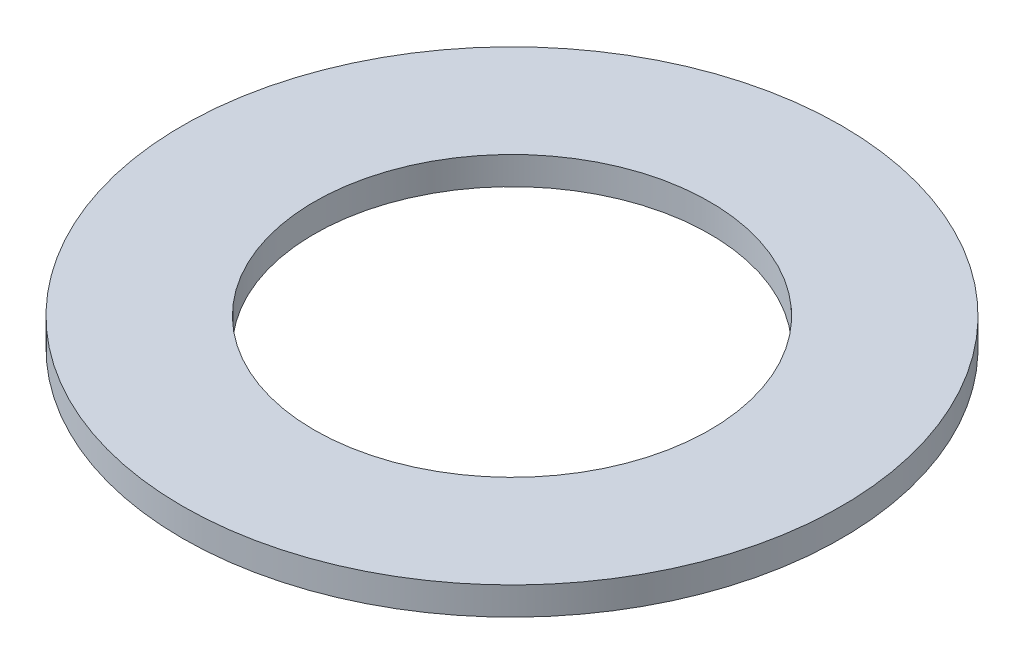
ISO-10303-21;
HEADER;
FILE_DESCRIPTION(('STEP AP214'),'2;1');
FILE_NAME('part.step','',(''),(''),'','','');
FILE_SCHEMA(('AUTOMOTIVE_DESIGN { 1 0 10303 214 1 1 1 1 }'));
ENDSEC;
DATA;
#1=APPLICATION_CONTEXT('core data for automotive mechanical design processes');
#2=APPLICATION_PROTOCOL_DEFINITION('international standard','automotive_design',2000,#1);
#3=PRODUCT_CONTEXT('',#1,'mechanical');
#4=PRODUCT('Part','Part','',(#3));
#5=PRODUCT_RELATED_PRODUCT_CATEGORY('part','',(#4));
#6=PRODUCT_DEFINITION_FORMATION('','',#4);
#7=PRODUCT_DEFINITION_CONTEXT('part definition',#1,'design');
#8=PRODUCT_DEFINITION('design','',#6,#7);
#9=PRODUCT_DEFINITION_SHAPE('','',#8);
#10=(LENGTH_UNIT() NAMED_UNIT(*) SI_UNIT(.MILLI.,.METRE.));
#11=(NAMED_UNIT(*) PLANE_ANGLE_UNIT() SI_UNIT($,.RADIAN.));
#12=(NAMED_UNIT(*) SI_UNIT($,.STERADIAN.) SOLID_ANGLE_UNIT());
#13=UNCERTAINTY_MEASURE_WITH_UNIT(LENGTH_MEASURE(1.E-05),#10,'distance_accuracy_value','');
#14=(GEOMETRIC_REPRESENTATION_CONTEXT(3) GLOBAL_UNCERTAINTY_ASSIGNED_CONTEXT((#13)) GLOBAL_UNIT_ASSIGNED_CONTEXT((#10,
#11,#12)) REPRESENTATION_CONTEXT('',''));
#15=CARTESIAN_POINT('',(0.,0.,0.));
#16=DIRECTION('',(0.,0.,1.));
#17=DIRECTION('',(1.,0.,0.));
#18=AXIS2_PLACEMENT_3D('',#15,#16,#17);
#19=CARTESIAN_POINT('',(0.,6.35,0.));
#20=DIRECTION('',(0.,-1.,0.));
#21=DIRECTION('',(0.,0.,-1.));
#22=AXIS2_PLACEMENT_3D('',#19,#20,#21);
#23=CYLINDRICAL_SURFACE('',#22,75.);
#24=CARTESIAN_POINT('',(0.,6.35,0.));
#25=DIRECTION('',(0.,1.,0.));
#26=DIRECTION('',(0.,0.,1.));
#27=AXIS2_PLACEMENT_3D('',#24,#25,#26);
#28=CIRCLE('',#27,75.);
#29=CARTESIAN_POINT('',(0.,6.35,75.));
#30=VERTEX_POINT('',#29);
#31=EDGE_CURVE('E10',#30,#30,#28,.T.);
#32=ORIENTED_EDGE('',*,*,#31,.F.);
#33=EDGE_LOOP('',(#32));
#34=FACE_BOUND('',#33,.T.);
#35=CARTESIAN_POINT('',(0.,0.,0.));
#36=DIRECTION('',(0.,1.,0.));
#37=DIRECTION('',(0.,0.,1.));
#38=AXIS2_PLACEMENT_3D('',#35,#36,#37);
#39=CIRCLE('',#38,75.);
#40=CARTESIAN_POINT('',(0.,0.,75.));
#41=VERTEX_POINT('',#40);
#42=EDGE_CURVE('E40',#41,#41,#39,.T.);
#43=ORIENTED_EDGE('',*,*,#42,.T.);
#44=EDGE_LOOP('',(#43));
#45=FACE_BOUND('',#44,.T.);
#46=ADVANCED_FACE('F37',(#34,#45),#23,.T.);
#47=CARTESIAN_POINT('',(0.,6.35,0.));
#48=DIRECTION('',(0.,1.,0.));
#49=DIRECTION('',(0.,0.,1.));
#50=AXIS2_PLACEMENT_3D('',#47,#48,#49);
#51=PLANE('',#50);
#52=CARTESIAN_POINT('',(0.,6.35,0.));
#53=DIRECTION('',(0.,1.,0.));
#54=DIRECTION('',(0.,0.,1.));
#55=AXIS2_PLACEMENT_3D('',#52,#53,#54);
#56=CIRCLE('',#55,45.);
#57=CARTESIAN_POINT('',(0.,6.35,45.));
#58=VERTEX_POINT('',#57);
#59=EDGE_CURVE('E51',#58,#58,#56,.T.);
#60=ORIENTED_EDGE('',*,*,#59,.F.);
#61=EDGE_LOOP('',(#60));
#62=FACE_BOUND('',#61,.T.);
#63=ORIENTED_EDGE('',*,*,#31,.T.);
#64=EDGE_LOOP('',(#63));
#65=FACE_BOUND('',#64,.T.);
#66=ADVANCED_FACE('F68',(#62,#65),#51,.T.);
#67=CARTESIAN_POINT('',(0.,0.,0.));
#68=DIRECTION('',(0.,1.,0.));
#69=DIRECTION('',(0.,0.,1.));
#70=AXIS2_PLACEMENT_3D('',#67,#68,#69);
#71=PLANE('',#70);
#72=CARTESIAN_POINT('',(0.,0.,0.));
#73=DIRECTION('',(0.,1.,0.));
#74=DIRECTION('',(0.,0.,1.));
#75=AXIS2_PLACEMENT_3D('',#72,#73,#74);
#76=CIRCLE('',#75,45.);
#77=CARTESIAN_POINT('',(0.,0.,45.));
#78=VERTEX_POINT('',#77);
#79=EDGE_CURVE('E49',#78,#78,#76,.T.);
#80=ORIENTED_EDGE('',*,*,#79,.T.);
#81=EDGE_LOOP('',(#80));
#82=FACE_BOUND('',#81,.T.);
#83=ORIENTED_EDGE('',*,*,#42,.F.);
#84=EDGE_LOOP('',(#83));
#85=FACE_BOUND('',#84,.T.);
#86=ADVANCED_FACE('F59',(#82,#85),#71,.F.);
#87=CARTESIAN_POINT('',(0.,0.,0.));
#88=DIRECTION('',(0.,1.,0.));
#89=DIRECTION('',(0.,0.,1.));
#90=AXIS2_PLACEMENT_3D('',#87,#88,#89);
#91=CYLINDRICAL_SURFACE('',#90,45.);
#92=ORIENTED_EDGE('',*,*,#79,.F.);
#93=EDGE_LOOP('',(#92));
#94=FACE_BOUND('',#93,.T.);
#95=ORIENTED_EDGE('',*,*,#59,.T.);
#96=EDGE_LOOP('',(#95));
#97=FACE_BOUND('',#96,.T.);
#98=ADVANCED_FACE('F62',(#94,#97),#91,.F.);
#99=CLOSED_SHELL('',(#46,#66,#86,#98));
#100=MANIFOLD_SOLID_BREP('B2',#99);
#101=ADVANCED_BREP_SHAPE_REPRESENTATION('',(#18,#100),#14);
#102=SHAPE_DEFINITION_REPRESENTATION(#9,#101);
ENDSEC;
END-ISO-10303-21;
